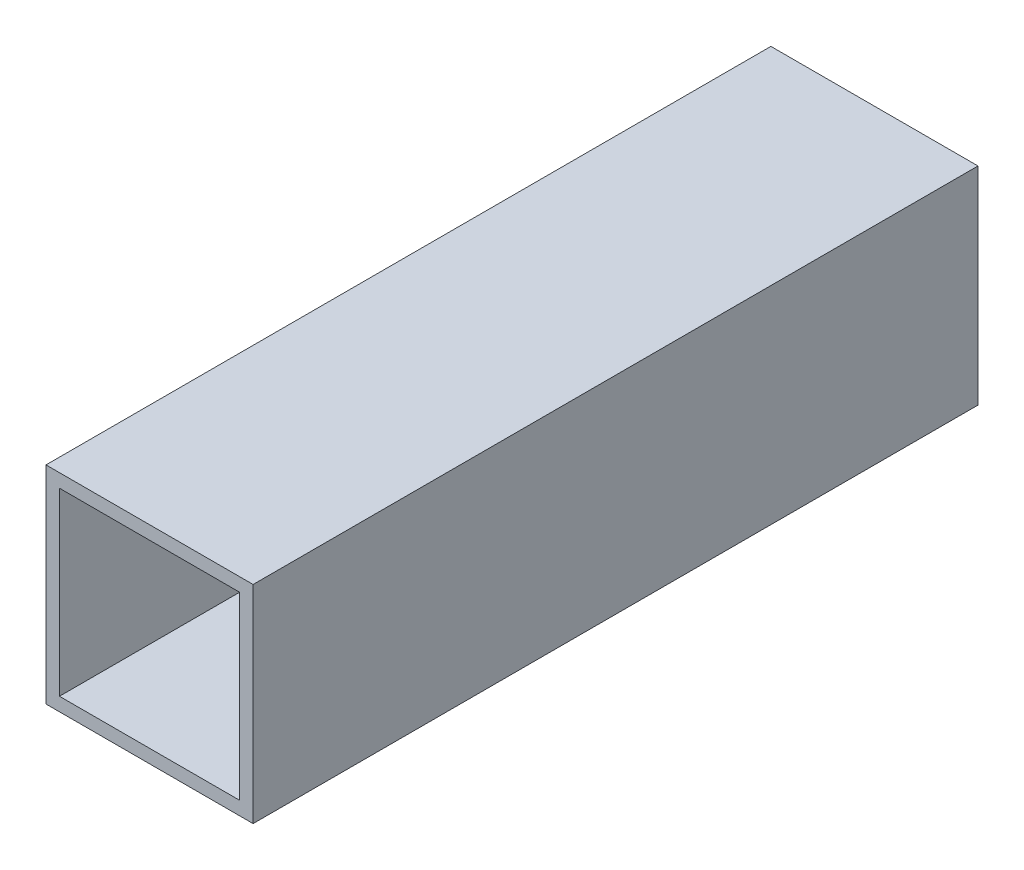
ISO-10303-21;
HEADER;
FILE_DESCRIPTION(('STEP AP214'),'2;1');
FILE_NAME('part.step','',(''),(''),'','','');
FILE_SCHEMA(('AUTOMOTIVE_DESIGN { 1 0 10303 214 1 1 1 1 }'));
ENDSEC;
DATA;
#1=APPLICATION_CONTEXT('core data for automotive mechanical design processes');
#2=APPLICATION_PROTOCOL_DEFINITION('international standard','automotive_design',2000,#1);
#3=PRODUCT_CONTEXT('',#1,'mechanical');
#4=PRODUCT('Part','Part','',(#3));
#5=PRODUCT_RELATED_PRODUCT_CATEGORY('part','',(#4));
#6=PRODUCT_DEFINITION_FORMATION('','',#4);
#7=PRODUCT_DEFINITION_CONTEXT('part definition',#1,'design');
#8=PRODUCT_DEFINITION('design','',#6,#7);
#9=PRODUCT_DEFINITION_SHAPE('','',#8);
#10=(LENGTH_UNIT() NAMED_UNIT(*) SI_UNIT(.MILLI.,.METRE.));
#11=(NAMED_UNIT(*) PLANE_ANGLE_UNIT() SI_UNIT($,.RADIAN.));
#12=(NAMED_UNIT(*) SI_UNIT($,.STERADIAN.) SOLID_ANGLE_UNIT());
#13=UNCERTAINTY_MEASURE_WITH_UNIT(LENGTH_MEASURE(1.E-05),#10,'distance_accuracy_value','');
#14=(GEOMETRIC_REPRESENTATION_CONTEXT(3) GLOBAL_UNCERTAINTY_ASSIGNED_CONTEXT((#13)) GLOBAL_UNIT_ASSIGNED_CONTEXT((#10,
#11,#12)) REPRESENTATION_CONTEXT('',''));
#15=CARTESIAN_POINT('',(0.,0.,0.));
#16=DIRECTION('',(0.,0.,1.));
#17=DIRECTION('',(1.,0.,0.));
#18=AXIS2_PLACEMENT_3D('',#15,#16,#17);
#19=CARTESIAN_POINT('',(-58.5075862068965,-35.6475862068965,88.9));
#20=DIRECTION('',(1.,0.,0.));
#21=DIRECTION('',(0.,0.,-1.));
#22=AXIS2_PLACEMENT_3D('',#19,#20,#21);
#23=PLANE('',#22);
#24=DIRECTION('',(0.,-1.,0.));
#25=VECTOR('',#24,1.);
#26=CARTESIAN_POINT('',(-58.5075862068965,-35.6475862068965,0.));
#27=LINE('',#26,#25);
#28=CARTESIAN_POINT('',(-58.5075862068965,-10.2475862068965,0.));
#29=VERTEX_POINT('',#28);
#30=CARTESIAN_POINT('',(-58.5075862068965,-35.6475862068965,0.));
#31=VERTEX_POINT('',#30);
#32=EDGE_CURVE('E130',#29,#31,#27,.T.);
#33=ORIENTED_EDGE('',*,*,#32,.T.);
#34=DIRECTION('',(0.,0.,-1.));
#35=VECTOR('',#34,1.);
#36=CARTESIAN_POINT('',(-58.5075862068965,-35.6475862068965,88.9));
#37=LINE('',#36,#35);
#38=CARTESIAN_POINT('',(-58.5075862068965,-35.6475862068965,88.9));
#39=VERTEX_POINT('',#38);
#40=EDGE_CURVE('E11',#39,#31,#37,.T.);
#41=ORIENTED_EDGE('',*,*,#40,.F.);
#42=DIRECTION('',(0.,-1.,0.));
#43=VECTOR('',#42,1.);
#44=CARTESIAN_POINT('',(-58.5075862068965,-35.6475862068965,88.9));
#45=LINE('',#44,#43);
#46=CARTESIAN_POINT('',(-58.5075862068965,-10.2475862068965,88.9));
#47=VERTEX_POINT('',#46);
#48=EDGE_CURVE('E134',#47,#39,#45,.T.);
#49=ORIENTED_EDGE('',*,*,#48,.F.);
#50=DIRECTION('',(0.,0.,-1.));
#51=VECTOR('',#50,1.);
#52=CARTESIAN_POINT('',(-58.5075862068965,-10.2475862068965,88.9));
#53=LINE('',#52,#51);
#54=EDGE_CURVE('E144',#47,#29,#53,.T.);
#55=ORIENTED_EDGE('',*,*,#54,.T.);
#56=EDGE_LOOP('',(#33,#41,#49,#55));
#57=FACE_BOUND('',#56,.T.);
#58=ADVANCED_FACE('F33',(#57),#23,.F.);
#59=CARTESIAN_POINT('',(-58.5075862068965,-35.6475862068965,88.9));
#60=DIRECTION('',(0.,1.,0.));
#61=DIRECTION('',(0.,0.,1.));
#62=AXIS2_PLACEMENT_3D('',#59,#60,#61);
#63=PLANE('',#62);
#64=DIRECTION('',(1.,0.,0.));
#65=VECTOR('',#64,1.);
#66=CARTESIAN_POINT('',(-58.5075862068965,-35.6475862068965,0.));
#67=LINE('',#66,#65);
#68=CARTESIAN_POINT('',(-33.1075862068965,-35.6475862068965,0.));
#69=VERTEX_POINT('',#68);
#70=EDGE_CURVE('E147',#31,#69,#67,.T.);
#71=ORIENTED_EDGE('',*,*,#70,.T.);
#72=DIRECTION('',(0.,0.,-1.));
#73=VECTOR('',#72,1.);
#74=CARTESIAN_POINT('',(-33.1075862068965,-35.6475862068965,88.9));
#75=LINE('',#74,#73);
#76=CARTESIAN_POINT('',(-33.1075862068965,-35.6475862068965,88.9));
#77=VERTEX_POINT('',#76);
#78=EDGE_CURVE('E40',#77,#69,#75,.T.);
#79=ORIENTED_EDGE('',*,*,#78,.F.);
#80=DIRECTION('',(1.,0.,0.));
#81=VECTOR('',#80,1.);
#82=CARTESIAN_POINT('',(-58.5075862068965,-35.6475862068965,88.9));
#83=LINE('',#82,#81);
#84=EDGE_CURVE('E137',#39,#77,#83,.T.);
#85=ORIENTED_EDGE('',*,*,#84,.F.);
#86=ORIENTED_EDGE('',*,*,#40,.T.);
#87=EDGE_LOOP('',(#71,#79,#85,#86));
#88=FACE_BOUND('',#87,.T.);
#89=ADVANCED_FACE('F175',(#88),#63,.F.);
#90=CARTESIAN_POINT('',(-33.1075862068965,-35.6475862068965,88.9));
#91=DIRECTION('',(-1.,0.,0.));
#92=DIRECTION('',(0.,0.,1.));
#93=AXIS2_PLACEMENT_3D('',#90,#91,#92);
#94=PLANE('',#93);
#95=DIRECTION('',(0.,1.,0.));
#96=VECTOR('',#95,1.);
#97=CARTESIAN_POINT('',(-33.1075862068965,-35.6475862068965,0.));
#98=LINE('',#97,#96);
#99=CARTESIAN_POINT('',(-33.1075862068965,-10.2475862068965,0.));
#100=VERTEX_POINT('',#99);
#101=EDGE_CURVE('E149',#69,#100,#98,.T.);
#102=ORIENTED_EDGE('',*,*,#101,.T.);
#103=DIRECTION('',(0.,0.,-1.));
#104=VECTOR('',#103,1.);
#105=CARTESIAN_POINT('',(-33.1075862068965,-10.2475862068965,88.9));
#106=LINE('',#105,#104);
#107=CARTESIAN_POINT('',(-33.1075862068965,-10.2475862068965,88.9));
#108=VERTEX_POINT('',#107);
#109=EDGE_CURVE('E154',#108,#100,#106,.T.);
#110=ORIENTED_EDGE('',*,*,#109,.F.);
#111=DIRECTION('',(0.,1.,0.));
#112=VECTOR('',#111,1.);
#113=CARTESIAN_POINT('',(-33.1075862068965,-35.6475862068965,88.9));
#114=LINE('',#113,#112);
#115=EDGE_CURVE('E140',#77,#108,#114,.T.);
#116=ORIENTED_EDGE('',*,*,#115,.F.);
#117=ORIENTED_EDGE('',*,*,#78,.T.);
#118=EDGE_LOOP('',(#102,#110,#116,#117));
#119=FACE_BOUND('',#118,.T.);
#120=ADVANCED_FACE('F161',(#119),#94,.F.);
#121=CARTESIAN_POINT('',(-58.5075862068965,-10.2475862068965,88.9));
#122=DIRECTION('',(0.,-1.,0.));
#123=DIRECTION('',(1.,0.,0.));
#124=AXIS2_PLACEMENT_3D('',#121,#122,#123);
#125=PLANE('',#124);
#126=DIRECTION('',(-1.,0.,0.));
#127=VECTOR('',#126,1.);
#128=CARTESIAN_POINT('',(-58.5075862068965,-10.2475862068965,0.));
#129=LINE('',#128,#127);
#130=EDGE_CURVE('E138',#100,#29,#129,.T.);
#131=ORIENTED_EDGE('',*,*,#130,.T.);
#132=ORIENTED_EDGE('',*,*,#54,.F.);
#133=DIRECTION('',(-1.,0.,0.));
#134=VECTOR('',#133,1.);
#135=CARTESIAN_POINT('',(-58.5075862068965,-10.2475862068965,88.9));
#136=LINE('',#135,#134);
#137=EDGE_CURVE('E142',#108,#47,#136,.T.);
#138=ORIENTED_EDGE('',*,*,#137,.F.);
#139=ORIENTED_EDGE('',*,*,#109,.T.);
#140=EDGE_LOOP('',(#131,#132,#138,#139));
#141=FACE_BOUND('',#140,.T.);
#142=ADVANCED_FACE('F168',(#141),#125,.F.);
#143=CARTESIAN_POINT('',(0.,0.,88.9));
#144=DIRECTION('',(0.,0.,-1.));
#145=DIRECTION('',(-1.,0.,0.));
#146=AXIS2_PLACEMENT_3D('',#143,#144,#145);
#147=PLANE('',#146);
#148=DIRECTION('',(-1.,0.,0.));
#149=VECTOR('',#148,1.);
#150=CARTESIAN_POINT('',(-56.8565862068965,-11.8985862068965,88.9));
#151=LINE('',#150,#149);
#152=CARTESIAN_POINT('',(-34.7585862068965,-11.8985862068965,88.9));
#153=VERTEX_POINT('',#152);
#154=CARTESIAN_POINT('',(-56.8565862068965,-11.8985862068965,88.9));
#155=VERTEX_POINT('',#154);
#156=EDGE_CURVE('E124',#153,#155,#151,.T.);
#157=ORIENTED_EDGE('',*,*,#156,.F.);
#158=DIRECTION('',(0.,1.,0.));
#159=VECTOR('',#158,1.);
#160=CARTESIAN_POINT('',(-34.7585862068965,-11.8985862068965,88.9));
#161=LINE('',#160,#159);
#162=CARTESIAN_POINT('',(-34.7585862068965,-33.9965862068965,88.9));
#163=VERTEX_POINT('',#162);
#164=EDGE_CURVE('E47',#163,#153,#161,.T.);
#165=ORIENTED_EDGE('',*,*,#164,.F.);
#166=DIRECTION('',(1.,0.,0.));
#167=VECTOR('',#166,1.);
#168=CARTESIAN_POINT('',(-56.8565862068965,-33.9965862068965,88.9));
#169=LINE('',#168,#167);
#170=CARTESIAN_POINT('',(-56.8565862068965,-33.9965862068965,88.9));
#171=VERTEX_POINT('',#170);
#172=EDGE_CURVE('E115',#171,#163,#169,.T.);
#173=ORIENTED_EDGE('',*,*,#172,.F.);
#174=DIRECTION('',(0.,-1.,0.));
#175=VECTOR('',#174,1.);
#176=CARTESIAN_POINT('',(-56.8565862068965,-11.8985862068965,88.9));
#177=LINE('',#176,#175);
#178=EDGE_CURVE('E118',#155,#171,#177,.T.);
#179=ORIENTED_EDGE('',*,*,#178,.F.);
#180=EDGE_LOOP('',(#157,#165,#173,#179));
#181=FACE_BOUND('',#180,.T.);
#182=ORIENTED_EDGE('',*,*,#48,.T.);
#183=ORIENTED_EDGE('',*,*,#84,.T.);
#184=ORIENTED_EDGE('',*,*,#115,.T.);
#185=ORIENTED_EDGE('',*,*,#137,.T.);
#186=EDGE_LOOP('',(#182,#183,#184,#185));
#187=FACE_BOUND('',#186,.T.);
#188=ADVANCED_FACE('F174',(#181,#187),#147,.F.);
#189=CARTESIAN_POINT('',(0.,0.,0.));
#190=DIRECTION('',(0.,0.,-1.));
#191=DIRECTION('',(-1.,0.,0.));
#192=AXIS2_PLACEMENT_3D('',#189,#190,#191);
#193=PLANE('',#192);
#194=DIRECTION('',(0.,1.,0.));
#195=VECTOR('',#194,1.);
#196=CARTESIAN_POINT('',(-34.7585862068965,-11.8985862068965,0.));
#197=LINE('',#196,#195);
#198=CARTESIAN_POINT('',(-34.7585862068965,-33.9965862068965,0.));
#199=VERTEX_POINT('',#198);
#200=CARTESIAN_POINT('',(-34.7585862068965,-11.8985862068965,0.));
#201=VERTEX_POINT('',#200);
#202=EDGE_CURVE('E99',#199,#201,#197,.T.);
#203=ORIENTED_EDGE('',*,*,#202,.T.);
#204=DIRECTION('',(-1.,0.,0.));
#205=VECTOR('',#204,1.);
#206=CARTESIAN_POINT('',(-56.8565862068965,-11.8985862068965,0.));
#207=LINE('',#206,#205);
#208=CARTESIAN_POINT('',(-56.8565862068965,-11.8985862068965,0.));
#209=VERTEX_POINT('',#208);
#210=EDGE_CURVE('E108',#201,#209,#207,.T.);
#211=ORIENTED_EDGE('',*,*,#210,.T.);
#212=DIRECTION('',(0.,-1.,0.));
#213=VECTOR('',#212,1.);
#214=CARTESIAN_POINT('',(-56.8565862068965,-11.8985862068965,0.));
#215=LINE('',#214,#213);
#216=CARTESIAN_POINT('',(-56.8565862068965,-33.9965862068965,0.));
#217=VERTEX_POINT('',#216);
#218=EDGE_CURVE('E55',#209,#217,#215,.T.);
#219=ORIENTED_EDGE('',*,*,#218,.T.);
#220=DIRECTION('',(1.,0.,0.));
#221=VECTOR('',#220,1.);
#222=CARTESIAN_POINT('',(-56.8565862068965,-33.9965862068965,0.));
#223=LINE('',#222,#221);
#224=EDGE_CURVE('E105',#217,#199,#223,.T.);
#225=ORIENTED_EDGE('',*,*,#224,.T.);
#226=EDGE_LOOP('',(#203,#211,#219,#225));
#227=FACE_BOUND('',#226,.T.);
#228=ORIENTED_EDGE('',*,*,#32,.F.);
#229=ORIENTED_EDGE('',*,*,#130,.F.);
#230=ORIENTED_EDGE('',*,*,#101,.F.);
#231=ORIENTED_EDGE('',*,*,#70,.F.);
#232=EDGE_LOOP('',(#228,#229,#230,#231));
#233=FACE_BOUND('',#232,.T.);
#234=ADVANCED_FACE('F112',(#227,#233),#193,.T.);
#235=CARTESIAN_POINT('',(-34.7585862068965,-11.8985862068965,0.));
#236=DIRECTION('',(1.,0.,0.));
#237=DIRECTION('',(0.,1.,0.));
#238=AXIS2_PLACEMENT_3D('',#235,#236,#237);
#239=PLANE('',#238);
#240=ORIENTED_EDGE('',*,*,#164,.T.);
#241=DIRECTION('',(0.,0.,1.));
#242=VECTOR('',#241,1.);
#243=CARTESIAN_POINT('',(-34.7585862068965,-11.8985862068965,0.));
#244=LINE('',#243,#242);
#245=EDGE_CURVE('E95',#201,#153,#244,.T.);
#246=ORIENTED_EDGE('',*,*,#245,.F.);
#247=ORIENTED_EDGE('',*,*,#202,.F.);
#248=DIRECTION('',(0.,0.,1.));
#249=VECTOR('',#248,1.);
#250=CARTESIAN_POINT('',(-34.7585862068965,-33.9965862068965,0.));
#251=LINE('',#250,#249);
#252=EDGE_CURVE('E128',#199,#163,#251,.T.);
#253=ORIENTED_EDGE('',*,*,#252,.T.);
#254=EDGE_LOOP('',(#240,#246,#247,#253));
#255=FACE_BOUND('',#254,.T.);
#256=ADVANCED_FACE('F97',(#255),#239,.F.);
#257=CARTESIAN_POINT('',(-56.8565862068965,-33.9965862068965,0.));
#258=DIRECTION('',(0.,-1.,0.));
#259=DIRECTION('',(0.,0.,-1.));
#260=AXIS2_PLACEMENT_3D('',#257,#258,#259);
#261=PLANE('',#260);
#262=ORIENTED_EDGE('',*,*,#172,.T.);
#263=ORIENTED_EDGE('',*,*,#252,.F.);
#264=ORIENTED_EDGE('',*,*,#224,.F.);
#265=DIRECTION('',(0.,0.,1.));
#266=VECTOR('',#265,1.);
#267=CARTESIAN_POINT('',(-56.8565862068965,-33.9965862068965,0.));
#268=LINE('',#267,#266);
#269=EDGE_CURVE('E131',#217,#171,#268,.T.);
#270=ORIENTED_EDGE('',*,*,#269,.T.);
#271=EDGE_LOOP('',(#262,#263,#264,#270));
#272=FACE_BOUND('',#271,.T.);
#273=ADVANCED_FACE('F192',(#272),#261,.F.);
#274=CARTESIAN_POINT('',(-56.8565862068965,-11.8985862068965,0.));
#275=DIRECTION('',(-1.,0.,0.));
#276=DIRECTION('',(0.,0.,1.));
#277=AXIS2_PLACEMENT_3D('',#274,#275,#276);
#278=PLANE('',#277);
#279=ORIENTED_EDGE('',*,*,#178,.T.);
#280=ORIENTED_EDGE('',*,*,#269,.F.);
#281=ORIENTED_EDGE('',*,*,#218,.F.);
#282=DIRECTION('',(0.,0.,1.));
#283=VECTOR('',#282,1.);
#284=CARTESIAN_POINT('',(-56.8565862068965,-11.8985862068965,0.));
#285=LINE('',#284,#283);
#286=EDGE_CURVE('E104',#209,#155,#285,.T.);
#287=ORIENTED_EDGE('',*,*,#286,.T.);
#288=EDGE_LOOP('',(#279,#280,#281,#287));
#289=FACE_BOUND('',#288,.T.);
#290=ADVANCED_FACE('F195',(#289),#278,.F.);
#291=CARTESIAN_POINT('',(-56.8565862068965,-11.8985862068965,0.));
#292=DIRECTION('',(0.,1.,0.));
#293=DIRECTION('',(0.,0.,1.));
#294=AXIS2_PLACEMENT_3D('',#291,#292,#293);
#295=PLANE('',#294);
#296=ORIENTED_EDGE('',*,*,#156,.T.);
#297=ORIENTED_EDGE('',*,*,#286,.F.);
#298=ORIENTED_EDGE('',*,*,#210,.F.);
#299=ORIENTED_EDGE('',*,*,#245,.T.);
#300=EDGE_LOOP('',(#296,#297,#298,#299));
#301=FACE_BOUND('',#300,.T.);
#302=ADVANCED_FACE('F109',(#301),#295,.F.);
#303=CLOSED_SHELL('',(#58,#89,#120,#142,#188,#234,#256,#273,#290,#302));
#304=MANIFOLD_SOLID_BREP('B2',#303);
#305=ADVANCED_BREP_SHAPE_REPRESENTATION('',(#18,#304),#14);
#306=SHAPE_DEFINITION_REPRESENTATION(#9,#305);
ENDSEC;
END-ISO-10303-21;
